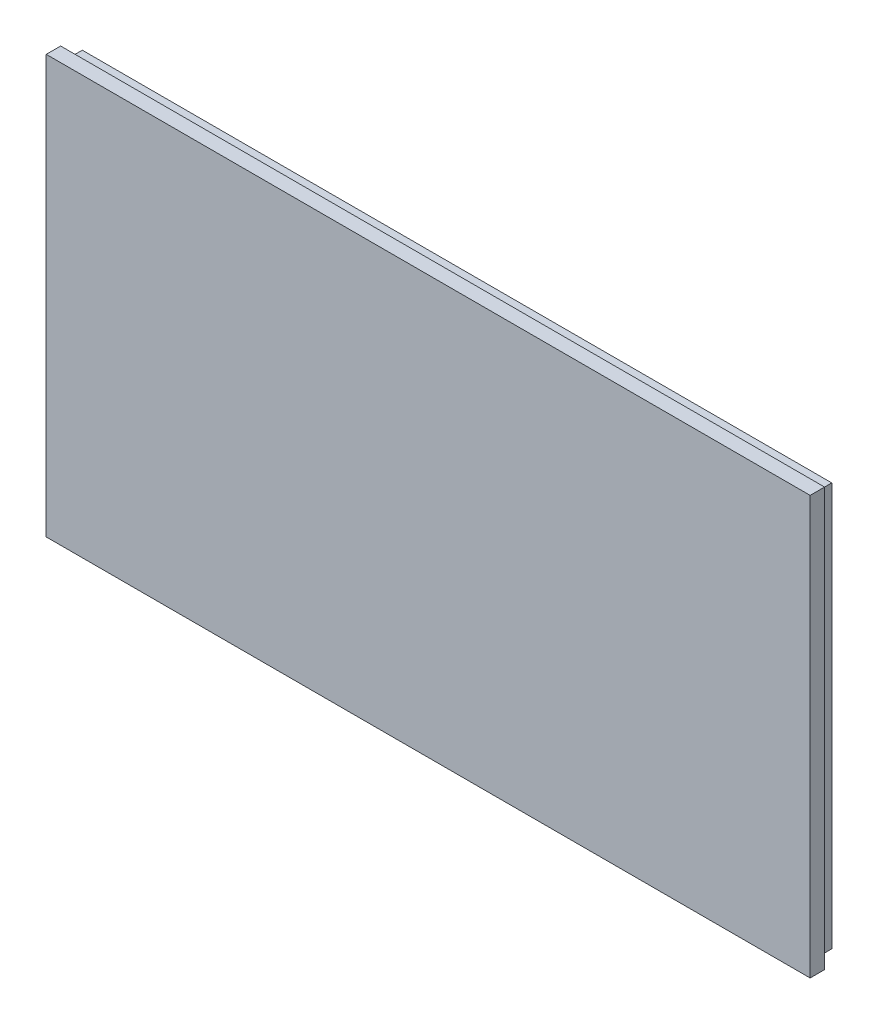
ISO-10303-21;
HEADER;
FILE_DESCRIPTION(('STEP AP214'),'2;1');
FILE_NAME('part.step','',(''),(''),'','','');
FILE_SCHEMA(('AUTOMOTIVE_DESIGN { 1 0 10303 214 1 1 1 1 }'));
ENDSEC;
DATA;
#1=APPLICATION_CONTEXT('core data for automotive mechanical design processes');
#2=APPLICATION_PROTOCOL_DEFINITION('international standard','automotive_design',2000,#1);
#3=PRODUCT_CONTEXT('',#1,'mechanical');
#4=PRODUCT('Part','Part','',(#3));
#5=PRODUCT_RELATED_PRODUCT_CATEGORY('part','',(#4));
#6=PRODUCT_DEFINITION_FORMATION('','',#4);
#7=PRODUCT_DEFINITION_CONTEXT('part definition',#1,'design');
#8=PRODUCT_DEFINITION('design','',#6,#7);
#9=PRODUCT_DEFINITION_SHAPE('','',#8);
#10=(LENGTH_UNIT() NAMED_UNIT(*) SI_UNIT(.MILLI.,.METRE.));
#11=(NAMED_UNIT(*) PLANE_ANGLE_UNIT() SI_UNIT($,.RADIAN.));
#12=(NAMED_UNIT(*) SI_UNIT($,.STERADIAN.) SOLID_ANGLE_UNIT());
#13=UNCERTAINTY_MEASURE_WITH_UNIT(LENGTH_MEASURE(1.E-05),#10,'distance_accuracy_value','');
#14=(GEOMETRIC_REPRESENTATION_CONTEXT(3) GLOBAL_UNCERTAINTY_ASSIGNED_CONTEXT((#13)) GLOBAL_UNIT_ASSIGNED_CONTEXT((#10,
#11,#12)) REPRESENTATION_CONTEXT('',''));
#15=CARTESIAN_POINT('',(0.,0.,0.));
#16=DIRECTION('',(0.,0.,1.));
#17=DIRECTION('',(1.,0.,0.));
#18=AXIS2_PLACEMENT_3D('',#15,#16,#17);
#19=CARTESIAN_POINT('',(0.,0.,-1.));
#20=DIRECTION('',(0.,0.,1.));
#21=DIRECTION('',(1.,0.,0.));
#22=AXIS2_PLACEMENT_3D('',#19,#20,#21);
#23=PLANE('',#22);
#24=DIRECTION('',(0.,1.,0.));
#25=VECTOR('',#24,1.);
#26=CARTESIAN_POINT('',(-26.,-14.,-1.));
#27=LINE('',#26,#25);
#28=CARTESIAN_POINT('',(-26.,-14.,-1.));
#29=VERTEX_POINT('',#28);
#30=CARTESIAN_POINT('',(-26.,14.,-1.));
#31=VERTEX_POINT('',#30);
#32=EDGE_CURVE('E174',#29,#31,#27,.T.);
#33=ORIENTED_EDGE('',*,*,#32,.T.);
#34=DIRECTION('',(1.,0.,0.));
#35=VECTOR('',#34,1.);
#36=CARTESIAN_POINT('',(26.,14.,-1.));
#37=LINE('',#36,#35);
#38=CARTESIAN_POINT('',(26.,14.,-1.));
#39=VERTEX_POINT('',#38);
#40=EDGE_CURVE('E178',#31,#39,#37,.T.);
#41=ORIENTED_EDGE('',*,*,#40,.T.);
#42=DIRECTION('',(0.,-1.,0.));
#43=VECTOR('',#42,1.);
#44=CARTESIAN_POINT('',(26.,-14.,-1.));
#45=LINE('',#44,#43);
#46=CARTESIAN_POINT('',(26.,-14.,-1.));
#47=VERTEX_POINT('',#46);
#48=EDGE_CURVE('E182',#39,#47,#45,.T.);
#49=ORIENTED_EDGE('',*,*,#48,.T.);
#50=DIRECTION('',(-1.,0.,0.));
#51=VECTOR('',#50,1.);
#52=CARTESIAN_POINT('',(26.,-14.,-1.));
#53=LINE('',#52,#51);
#54=EDGE_CURVE('E185',#47,#29,#53,.T.);
#55=ORIENTED_EDGE('',*,*,#54,.T.);
#56=EDGE_LOOP('',(#33,#41,#49,#55));
#57=FACE_BOUND('',#56,.T.);
#58=DIRECTION('',(0.,1.,0.));
#59=VECTOR('',#58,1.);
#60=CARTESIAN_POINT('',(-25.,0.,-1.));
#61=LINE('',#60,#59);
#62=CARTESIAN_POINT('',(-25.,-13.,-1.));
#63=VERTEX_POINT('',#62);
#64=CARTESIAN_POINT('',(-25.,13.,-1.));
#65=VERTEX_POINT('',#64);
#66=EDGE_CURVE('E130',#63,#65,#61,.T.);
#67=ORIENTED_EDGE('',*,*,#66,.F.);
#68=DIRECTION('',(-1.,0.,0.));
#69=VECTOR('',#68,1.);
#70=CARTESIAN_POINT('',(0.,-13.,-1.));
#71=LINE('',#70,#69);
#72=CARTESIAN_POINT('',(25.,-13.,-1.));
#73=VERTEX_POINT('',#72);
#74=EDGE_CURVE('E158',#73,#63,#71,.T.);
#75=ORIENTED_EDGE('',*,*,#74,.F.);
#76=DIRECTION('',(0.,-1.,0.));
#77=VECTOR('',#76,1.);
#78=CARTESIAN_POINT('',(25.,0.,-1.));
#79=LINE('',#78,#77);
#80=CARTESIAN_POINT('',(25.,13.,-1.));
#81=VERTEX_POINT('',#80);
#82=EDGE_CURVE('E154',#81,#73,#79,.T.);
#83=ORIENTED_EDGE('',*,*,#82,.F.);
#84=DIRECTION('',(1.,0.,0.));
#85=VECTOR('',#84,1.);
#86=CARTESIAN_POINT('',(0.,13.,-1.));
#87=LINE('',#86,#85);
#88=EDGE_CURVE('E140',#65,#81,#87,.T.);
#89=ORIENTED_EDGE('',*,*,#88,.F.);
#90=EDGE_LOOP('',(#67,#75,#83,#89));
#91=FACE_BOUND('',#90,.T.);
#92=ADVANCED_FACE('F39',(#57,#91),#23,.F.);
#93=CARTESIAN_POINT('',(26.5,-14.5,1.));
#94=DIRECTION('',(-1.,0.,0.));
#95=DIRECTION('',(0.,0.,1.));
#96=AXIS2_PLACEMENT_3D('',#93,#94,#95);
#97=PLANE('',#96);
#98=DIRECTION('',(0.,1.,0.));
#99=VECTOR('',#98,1.);
#100=CARTESIAN_POINT('',(26.5,-14.5,0.));
#101=LINE('',#100,#99);
#102=CARTESIAN_POINT('',(26.5,-14.5,0.));
#103=VERTEX_POINT('',#102);
#104=CARTESIAN_POINT('',(26.5,14.5,0.));
#105=VERTEX_POINT('',#104);
#106=EDGE_CURVE('E216',#103,#105,#101,.T.);
#107=ORIENTED_EDGE('',*,*,#106,.T.);
#108=DIRECTION('',(0.,0.,-1.));
#109=VECTOR('',#108,1.);
#110=CARTESIAN_POINT('',(26.5,14.5,1.));
#111=LINE('',#110,#109);
#112=CARTESIAN_POINT('',(26.5,14.5,1.));
#113=VERTEX_POINT('',#112);
#114=EDGE_CURVE('E11',#113,#105,#111,.T.);
#115=ORIENTED_EDGE('',*,*,#114,.F.);
#116=DIRECTION('',(0.,1.,0.));
#117=VECTOR('',#116,1.);
#118=CARTESIAN_POINT('',(26.5,-14.5,1.));
#119=LINE('',#118,#117);
#120=CARTESIAN_POINT('',(26.5,-14.5,1.));
#121=VERTEX_POINT('',#120);
#122=EDGE_CURVE('E217',#121,#113,#119,.T.);
#123=ORIENTED_EDGE('',*,*,#122,.F.);
#124=DIRECTION('',(0.,0.,-1.));
#125=VECTOR('',#124,1.);
#126=CARTESIAN_POINT('',(26.5,-14.5,1.));
#127=LINE('',#126,#125);
#128=EDGE_CURVE('E231',#121,#103,#127,.T.);
#129=ORIENTED_EDGE('',*,*,#128,.T.);
#130=EDGE_LOOP('',(#107,#115,#123,#129));
#131=FACE_BOUND('',#130,.T.);
#132=ADVANCED_FACE('F41',(#131),#97,.F.);
#133=CARTESIAN_POINT('',(-26.5,14.5,1.));
#134=DIRECTION('',(0.,-1.,0.));
#135=DIRECTION('',(0.,0.,-1.));
#136=AXIS2_PLACEMENT_3D('',#133,#134,#135);
#137=PLANE('',#136);
#138=DIRECTION('',(-1.,0.,0.));
#139=VECTOR('',#138,1.);
#140=CARTESIAN_POINT('',(-26.5,14.5,0.));
#141=LINE('',#140,#139);
#142=CARTESIAN_POINT('',(-26.5,14.5,0.));
#143=VERTEX_POINT('',#142);
#144=EDGE_CURVE('E235',#105,#143,#141,.T.);
#145=ORIENTED_EDGE('',*,*,#144,.T.);
#146=DIRECTION('',(0.,0.,-1.));
#147=VECTOR('',#146,1.);
#148=CARTESIAN_POINT('',(-26.5,14.5,1.));
#149=LINE('',#148,#147);
#150=CARTESIAN_POINT('',(-26.5,14.5,1.));
#151=VERTEX_POINT('',#150);
#152=EDGE_CURVE('E48',#151,#143,#149,.T.);
#153=ORIENTED_EDGE('',*,*,#152,.F.);
#154=DIRECTION('',(-1.,0.,0.));
#155=VECTOR('',#154,1.);
#156=CARTESIAN_POINT('',(-26.5,14.5,1.));
#157=LINE('',#156,#155);
#158=EDGE_CURVE('E221',#113,#151,#157,.T.);
#159=ORIENTED_EDGE('',*,*,#158,.F.);
#160=ORIENTED_EDGE('',*,*,#114,.T.);
#161=EDGE_LOOP('',(#145,#153,#159,#160));
#162=FACE_BOUND('',#161,.T.);
#163=ADVANCED_FACE('F271',(#162),#137,.F.);
#164=CARTESIAN_POINT('',(-26.5,-14.5,1.));
#165=DIRECTION('',(1.,0.,0.));
#166=DIRECTION('',(0.,0.,-1.));
#167=AXIS2_PLACEMENT_3D('',#164,#165,#166);
#168=PLANE('',#167);
#169=DIRECTION('',(0.,-1.,0.));
#170=VECTOR('',#169,1.);
#171=CARTESIAN_POINT('',(-26.5,-14.5,0.));
#172=LINE('',#171,#170);
#173=CARTESIAN_POINT('',(-26.5,-14.5,0.));
#174=VERTEX_POINT('',#173);
#175=EDGE_CURVE('E238',#143,#174,#172,.T.);
#176=ORIENTED_EDGE('',*,*,#175,.T.);
#177=DIRECTION('',(0.,0.,-1.));
#178=VECTOR('',#177,1.);
#179=CARTESIAN_POINT('',(-26.5,-14.5,1.));
#180=LINE('',#179,#178);
#181=CARTESIAN_POINT('',(-26.5,-14.5,1.));
#182=VERTEX_POINT('',#181);
#183=EDGE_CURVE('E246',#182,#174,#180,.T.);
#184=ORIENTED_EDGE('',*,*,#183,.F.);
#185=DIRECTION('',(0.,-1.,0.));
#186=VECTOR('',#185,1.);
#187=CARTESIAN_POINT('',(-26.5,-14.5,1.));
#188=LINE('',#187,#186);
#189=EDGE_CURVE('E225',#151,#182,#188,.T.);
#190=ORIENTED_EDGE('',*,*,#189,.F.);
#191=ORIENTED_EDGE('',*,*,#152,.T.);
#192=EDGE_LOOP('',(#176,#184,#190,#191));
#193=FACE_BOUND('',#192,.T.);
#194=ADVANCED_FACE('F255',(#193),#168,.F.);
#195=CARTESIAN_POINT('',(-26.5,-14.5,1.));
#196=DIRECTION('',(0.,1.,0.));
#197=DIRECTION('',(0.,0.,1.));
#198=AXIS2_PLACEMENT_3D('',#195,#196,#197);
#199=PLANE('',#198);
#200=DIRECTION('',(1.,0.,0.));
#201=VECTOR('',#200,1.);
#202=CARTESIAN_POINT('',(-26.5,-14.5,0.));
#203=LINE('',#202,#201);
#204=EDGE_CURVE('E222',#174,#103,#203,.T.);
#205=ORIENTED_EDGE('',*,*,#204,.T.);
#206=ORIENTED_EDGE('',*,*,#128,.F.);
#207=DIRECTION('',(1.,0.,0.));
#208=VECTOR('',#207,1.);
#209=CARTESIAN_POINT('',(-26.5,-14.5,1.));
#210=LINE('',#209,#208);
#211=EDGE_CURVE('E228',#182,#121,#210,.T.);
#212=ORIENTED_EDGE('',*,*,#211,.F.);
#213=ORIENTED_EDGE('',*,*,#183,.T.);
#214=EDGE_LOOP('',(#205,#206,#212,#213));
#215=FACE_BOUND('',#214,.T.);
#216=ADVANCED_FACE('F264',(#215),#199,.F.);
#217=CARTESIAN_POINT('',(0.,0.,1.));
#218=DIRECTION('',(0.,0.,-1.));
#219=DIRECTION('',(-1.,0.,0.));
#220=AXIS2_PLACEMENT_3D('',#217,#218,#219);
#221=PLANE('',#220);
#222=ORIENTED_EDGE('',*,*,#122,.T.);
#223=ORIENTED_EDGE('',*,*,#158,.T.);
#224=ORIENTED_EDGE('',*,*,#189,.T.);
#225=ORIENTED_EDGE('',*,*,#211,.T.);
#226=EDGE_LOOP('',(#222,#223,#224,#225));
#227=FACE_BOUND('',#226,.T.);
#228=ADVANCED_FACE('F270',(#227),#221,.F.);
#229=CARTESIAN_POINT('',(0.,0.,0.));
#230=DIRECTION('',(0.,0.,-1.));
#231=DIRECTION('',(-1.,0.,0.));
#232=AXIS2_PLACEMENT_3D('',#229,#230,#231);
#233=PLANE('',#232);
#234=DIRECTION('',(0.,1.,0.));
#235=VECTOR('',#234,1.);
#236=CARTESIAN_POINT('',(-26.,-14.,0.));
#237=LINE('',#236,#235);
#238=CARTESIAN_POINT('',(-26.,-14.,0.));
#239=VERTEX_POINT('',#238);
#240=CARTESIAN_POINT('',(-26.,14.,0.));
#241=VERTEX_POINT('',#240);
#242=EDGE_CURVE('E63',#239,#241,#237,.T.);
#243=ORIENTED_EDGE('',*,*,#242,.F.);
#244=DIRECTION('',(-1.,0.,0.));
#245=VECTOR('',#244,1.);
#246=CARTESIAN_POINT('',(26.,-14.,0.));
#247=LINE('',#246,#245);
#248=CARTESIAN_POINT('',(26.,-14.,0.));
#249=VERTEX_POINT('',#248);
#250=EDGE_CURVE('E179',#249,#239,#247,.T.);
#251=ORIENTED_EDGE('',*,*,#250,.F.);
#252=DIRECTION('',(0.,-1.,0.));
#253=VECTOR('',#252,1.);
#254=CARTESIAN_POINT('',(26.,-14.,0.));
#255=LINE('',#254,#253);
#256=CARTESIAN_POINT('',(26.,14.,0.));
#257=VERTEX_POINT('',#256);
#258=EDGE_CURVE('E195',#257,#249,#255,.T.);
#259=ORIENTED_EDGE('',*,*,#258,.F.);
#260=DIRECTION('',(1.,0.,0.));
#261=VECTOR('',#260,1.);
#262=CARTESIAN_POINT('',(26.,14.,0.));
#263=LINE('',#262,#261);
#264=EDGE_CURVE('E191',#241,#257,#263,.T.);
#265=ORIENTED_EDGE('',*,*,#264,.F.);
#266=EDGE_LOOP('',(#243,#251,#259,#265));
#267=FACE_BOUND('',#266,.T.);
#268=ORIENTED_EDGE('',*,*,#106,.F.);
#269=ORIENTED_EDGE('',*,*,#204,.F.);
#270=ORIENTED_EDGE('',*,*,#175,.F.);
#271=ORIENTED_EDGE('',*,*,#144,.F.);
#272=EDGE_LOOP('',(#268,#269,#270,#271));
#273=FACE_BOUND('',#272,.T.);
#274=ADVANCED_FACE('F261',(#267,#273),#233,.T.);
#275=CARTESIAN_POINT('',(-26.,-14.,-1.));
#276=DIRECTION('',(1.,0.,0.));
#277=DIRECTION('',(0.,0.,-1.));
#278=AXIS2_PLACEMENT_3D('',#275,#276,#277);
#279=PLANE('',#278);
#280=ORIENTED_EDGE('',*,*,#242,.T.);
#281=DIRECTION('',(0.,0.,1.));
#282=VECTOR('',#281,1.);
#283=CARTESIAN_POINT('',(-26.,14.,-1.));
#284=LINE('',#283,#282);
#285=EDGE_CURVE('E212',#31,#241,#284,.T.);
#286=ORIENTED_EDGE('',*,*,#285,.F.);
#287=ORIENTED_EDGE('',*,*,#32,.F.);
#288=DIRECTION('',(0.,0.,1.));
#289=VECTOR('',#288,1.);
#290=CARTESIAN_POINT('',(-26.,-14.,-1.));
#291=LINE('',#290,#289);
#292=EDGE_CURVE('E188',#29,#239,#291,.T.);
#293=ORIENTED_EDGE('',*,*,#292,.T.);
#294=EDGE_LOOP('',(#280,#286,#287,#293));
#295=FACE_BOUND('',#294,.T.);
#296=ADVANCED_FACE('F299',(#295),#279,.F.);
#297=CARTESIAN_POINT('',(26.,14.,-1.));
#298=DIRECTION('',(0.,-1.,0.));
#299=DIRECTION('',(0.,0.,-1.));
#300=AXIS2_PLACEMENT_3D('',#297,#298,#299);
#301=PLANE('',#300);
#302=ORIENTED_EDGE('',*,*,#264,.T.);
#303=DIRECTION('',(0.,0.,1.));
#304=VECTOR('',#303,1.);
#305=CARTESIAN_POINT('',(26.,14.,-1.));
#306=LINE('',#305,#304);
#307=EDGE_CURVE('E208',#39,#257,#306,.T.);
#308=ORIENTED_EDGE('',*,*,#307,.F.);
#309=ORIENTED_EDGE('',*,*,#40,.F.);
#310=ORIENTED_EDGE('',*,*,#285,.T.);
#311=EDGE_LOOP('',(#302,#308,#309,#310));
#312=FACE_BOUND('',#311,.T.);
#313=ADVANCED_FACE('F295',(#312),#301,.F.);
#314=CARTESIAN_POINT('',(26.,-14.,-1.));
#315=DIRECTION('',(-1.,0.,0.));
#316=DIRECTION('',(0.,0.,1.));
#317=AXIS2_PLACEMENT_3D('',#314,#315,#316);
#318=PLANE('',#317);
#319=ORIENTED_EDGE('',*,*,#258,.T.);
#320=DIRECTION('',(0.,0.,1.));
#321=VECTOR('',#320,1.);
#322=CARTESIAN_POINT('',(26.,-14.,-1.));
#323=LINE('',#322,#321);
#324=EDGE_CURVE('E204',#47,#249,#323,.T.);
#325=ORIENTED_EDGE('',*,*,#324,.F.);
#326=ORIENTED_EDGE('',*,*,#48,.F.);
#327=ORIENTED_EDGE('',*,*,#307,.T.);
#328=EDGE_LOOP('',(#319,#325,#326,#327));
#329=FACE_BOUND('',#328,.T.);
#330=ADVANCED_FACE('F291',(#329),#318,.F.);
#331=CARTESIAN_POINT('',(26.,-14.,-1.));
#332=DIRECTION('',(0.,1.,0.));
#333=DIRECTION('',(0.,0.,1.));
#334=AXIS2_PLACEMENT_3D('',#331,#332,#333);
#335=PLANE('',#334);
#336=ORIENTED_EDGE('',*,*,#250,.T.);
#337=ORIENTED_EDGE('',*,*,#292,.F.);
#338=ORIENTED_EDGE('',*,*,#54,.F.);
#339=ORIENTED_EDGE('',*,*,#324,.T.);
#340=EDGE_LOOP('',(#336,#337,#338,#339));
#341=FACE_BOUND('',#340,.T.);
#342=ADVANCED_FACE('F287',(#341),#335,.F.);
#343=CARTESIAN_POINT('',(0.,0.,0.));
#344=DIRECTION('',(0.,0.,-1.));
#345=DIRECTION('',(-1.,0.,0.));
#346=AXIS2_PLACEMENT_3D('',#343,#344,#345);
#347=PLANE('',#346);
#348=DIRECTION('',(0.,1.,0.));
#349=VECTOR('',#348,1.);
#350=CARTESIAN_POINT('',(25.,0.,0.));
#351=LINE('',#350,#349);
#352=CARTESIAN_POINT('',(25.,-13.,0.));
#353=VERTEX_POINT('',#352);
#354=CARTESIAN_POINT('',(25.,13.,0.));
#355=VERTEX_POINT('',#354);
#356=EDGE_CURVE('E169',#353,#355,#351,.T.);
#357=ORIENTED_EDGE('',*,*,#356,.F.);
#358=DIRECTION('',(1.,0.,0.));
#359=VECTOR('',#358,1.);
#360=CARTESIAN_POINT('',(0.,-13.,0.));
#361=LINE('',#360,#359);
#362=CARTESIAN_POINT('',(-25.,-13.,0.));
#363=VERTEX_POINT('',#362);
#364=EDGE_CURVE('E166',#363,#353,#361,.T.);
#365=ORIENTED_EDGE('',*,*,#364,.F.);
#366=DIRECTION('',(0.,-1.,0.));
#367=VECTOR('',#366,1.);
#368=CARTESIAN_POINT('',(-25.,0.,0.));
#369=LINE('',#368,#367);
#370=CARTESIAN_POINT('',(-25.,13.,0.));
#371=VERTEX_POINT('',#370);
#372=EDGE_CURVE('E150',#371,#363,#369,.T.);
#373=ORIENTED_EDGE('',*,*,#372,.F.);
#374=DIRECTION('',(-1.,0.,0.));
#375=VECTOR('',#374,1.);
#376=CARTESIAN_POINT('',(0.,13.,0.));
#377=LINE('',#376,#375);
#378=EDGE_CURVE('E148',#355,#371,#377,.T.);
#379=ORIENTED_EDGE('',*,*,#378,.F.);
#380=EDGE_LOOP('',(#357,#365,#373,#379));
#381=FACE_BOUND('',#380,.T.);
#382=ADVANCED_FACE('F290',(#381),#347,.T.);
#383=CARTESIAN_POINT('',(-25.,-14.,-1.));
#384=DIRECTION('',(1.,0.,0.));
#385=DIRECTION('',(0.,0.,-1.));
#386=AXIS2_PLACEMENT_3D('',#383,#384,#385);
#387=PLANE('',#386);
#388=ORIENTED_EDGE('',*,*,#372,.T.);
#389=DIRECTION('',(0.,0.,1.));
#390=VECTOR('',#389,1.);
#391=CARTESIAN_POINT('',(-25.,-13.,-1.));
#392=LINE('',#391,#390);
#393=EDGE_CURVE('E135',#63,#363,#392,.T.);
#394=ORIENTED_EDGE('',*,*,#393,.F.);
#395=ORIENTED_EDGE('',*,*,#66,.T.);
#396=DIRECTION('',(0.,0.,1.));
#397=VECTOR('',#396,1.);
#398=CARTESIAN_POINT('',(-25.,13.,-1.));
#399=LINE('',#398,#397);
#400=EDGE_CURVE('E133',#65,#371,#399,.T.);
#401=ORIENTED_EDGE('',*,*,#400,.T.);
#402=EDGE_LOOP('',(#388,#394,#395,#401));
#403=FACE_BOUND('',#402,.T.);
#404=ADVANCED_FACE('F132',(#403),#387,.T.);
#405=CARTESIAN_POINT('',(26.,13.,-1.));
#406=DIRECTION('',(0.,-1.,0.));
#407=DIRECTION('',(0.,0.,-1.));
#408=AXIS2_PLACEMENT_3D('',#405,#406,#407);
#409=PLANE('',#408);
#410=ORIENTED_EDGE('',*,*,#378,.T.);
#411=ORIENTED_EDGE('',*,*,#400,.F.);
#412=ORIENTED_EDGE('',*,*,#88,.T.);
#413=DIRECTION('',(0.,0.,1.));
#414=VECTOR('',#413,1.);
#415=CARTESIAN_POINT('',(25.,13.,-1.));
#416=LINE('',#415,#414);
#417=EDGE_CURVE('E151',#81,#355,#416,.T.);
#418=ORIENTED_EDGE('',*,*,#417,.T.);
#419=EDGE_LOOP('',(#410,#411,#412,#418));
#420=FACE_BOUND('',#419,.T.);
#421=ADVANCED_FACE('F144',(#420),#409,.T.);
#422=CARTESIAN_POINT('',(25.,-14.,-1.));
#423=DIRECTION('',(-1.,0.,0.));
#424=DIRECTION('',(0.,0.,1.));
#425=AXIS2_PLACEMENT_3D('',#422,#423,#424);
#426=PLANE('',#425);
#427=ORIENTED_EDGE('',*,*,#356,.T.);
#428=ORIENTED_EDGE('',*,*,#417,.F.);
#429=ORIENTED_EDGE('',*,*,#82,.T.);
#430=DIRECTION('',(0.,0.,1.));
#431=VECTOR('',#430,1.);
#432=CARTESIAN_POINT('',(25.,-13.,-1.));
#433=LINE('',#432,#431);
#434=EDGE_CURVE('E55',#73,#353,#433,.T.);
#435=ORIENTED_EDGE('',*,*,#434,.T.);
#436=EDGE_LOOP('',(#427,#428,#429,#435));
#437=FACE_BOUND('',#436,.T.);
#438=ADVANCED_FACE('F356',(#437),#426,.T.);
#439=CARTESIAN_POINT('',(26.,-13.,-1.));
#440=DIRECTION('',(0.,1.,0.));
#441=DIRECTION('',(0.,0.,1.));
#442=AXIS2_PLACEMENT_3D('',#439,#440,#441);
#443=PLANE('',#442);
#444=ORIENTED_EDGE('',*,*,#364,.T.);
#445=ORIENTED_EDGE('',*,*,#434,.F.);
#446=ORIENTED_EDGE('',*,*,#74,.T.);
#447=ORIENTED_EDGE('',*,*,#393,.T.);
#448=EDGE_LOOP('',(#444,#445,#446,#447));
#449=FACE_BOUND('',#448,.T.);
#450=ADVANCED_FACE('F285',(#449),#443,.T.);
#451=CLOSED_SHELL('',(#92,#132,#163,#194,#216,#228,#274,#296,#313,#330,#342,#382,#404,#421,#438,#450));
#452=MANIFOLD_SOLID_BREP('B2',#451);
#453=ADVANCED_BREP_SHAPE_REPRESENTATION('',(#18,#452),#14);
#454=SHAPE_DEFINITION_REPRESENTATION(#9,#453);
ENDSEC;
END-ISO-10303-21;
